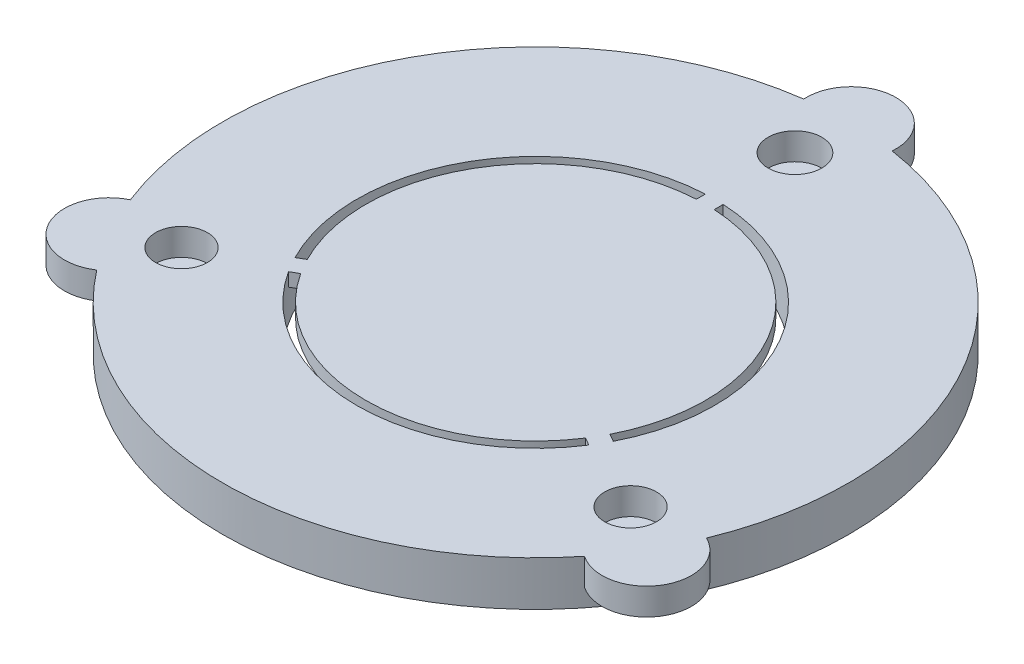
ISO-10303-21;
HEADER;
FILE_DESCRIPTION(('STEP AP214'),'2;1');
FILE_NAME('part.step','',(''),(''),'','','');
FILE_SCHEMA(('AUTOMOTIVE_DESIGN { 1 0 10303 214 1 1 1 1 }'));
ENDSEC;
DATA;
#1=APPLICATION_CONTEXT('core data for automotive mechanical design processes');
#2=APPLICATION_PROTOCOL_DEFINITION('international standard','automotive_design',2000,#1);
#3=PRODUCT_CONTEXT('',#1,'mechanical');
#4=PRODUCT('Part','Part','',(#3));
#5=PRODUCT_RELATED_PRODUCT_CATEGORY('part','',(#4));
#6=PRODUCT_DEFINITION_FORMATION('','',#4);
#7=PRODUCT_DEFINITION_CONTEXT('part definition',#1,'design');
#8=PRODUCT_DEFINITION('design','',#6,#7);
#9=PRODUCT_DEFINITION_SHAPE('','',#8);
#10=(LENGTH_UNIT() NAMED_UNIT(*) SI_UNIT(.MILLI.,.METRE.));
#11=(NAMED_UNIT(*) PLANE_ANGLE_UNIT() SI_UNIT($,.RADIAN.));
#12=(NAMED_UNIT(*) SI_UNIT($,.STERADIAN.) SOLID_ANGLE_UNIT());
#13=UNCERTAINTY_MEASURE_WITH_UNIT(LENGTH_MEASURE(1.E-05),#10,'distance_accuracy_value','');
#14=(GEOMETRIC_REPRESENTATION_CONTEXT(3) GLOBAL_UNCERTAINTY_ASSIGNED_CONTEXT((#13)) GLOBAL_UNIT_ASSIGNED_CONTEXT((#10,
#11,#12)) REPRESENTATION_CONTEXT('',''));
#15=CARTESIAN_POINT('',(0.,0.,0.));
#16=DIRECTION('',(0.,0.,1.));
#17=DIRECTION('',(1.,0.,0.));
#18=AXIS2_PLACEMENT_3D('',#15,#16,#17);
#19=CARTESIAN_POINT('',(0.,3.5,0.));
#20=DIRECTION('',(0.,1.,0.));
#21=DIRECTION('',(0.,0.,1.));
#22=AXIS2_PLACEMENT_3D('',#19,#20,#21);
#23=CYLINDRICAL_SURFACE('',#22,19.);
#24=DIRECTION('',(0.,1.,0.));
#25=VECTOR('',#24,1.);
#26=CARTESIAN_POINT('',(15.9316767251551,3.5,10.3528583842894));
#27=LINE('',#26,#25);
#28=CARTESIAN_POINT('',(15.9316767251551,5.,10.3528583842894));
#29=VERTEX_POINT('',#28);
#30=CARTESIAN_POINT('',(15.9316767251551,3.5,10.3528583842894));
#31=VERTEX_POINT('',#30);
#32=EDGE_CURVE('E11',#29,#31,#27,.F.);
#33=ORIENTED_EDGE('',*,*,#32,.F.);
#34=CARTESIAN_POINT('',(0.,5.,0.));
#35=DIRECTION('',(0.,1.,0.));
#36=DIRECTION('',(0.,0.,1.));
#37=AXIS2_PLACEMENT_3D('',#34,#35,#36);
#38=CIRCLE('',#37,19.);
#39=CARTESIAN_POINT('',(-15.9316767251549,5.,10.3528583842897));
#40=VERTEX_POINT('',#39);
#41=EDGE_CURVE('E222',#40,#29,#38,.T.);
#42=ORIENTED_EDGE('',*,*,#41,.F.);
#43=DIRECTION('',(0.,1.,0.));
#44=VECTOR('',#43,1.);
#45=CARTESIAN_POINT('',(-15.9316767251549,3.5,10.3528583842897));
#46=LINE('',#45,#44);
#47=CARTESIAN_POINT('',(-15.9316767251549,3.5,10.3528583842897));
#48=VERTEX_POINT('',#47);
#49=EDGE_CURVE('E329',#48,#40,#46,.T.);
#50=ORIENTED_EDGE('',*,*,#49,.F.);
#51=CARTESIAN_POINT('',(0.,3.5,0.));
#52=DIRECTION('',(0.,1.,0.));
#53=DIRECTION('',(0.,0.,1.));
#54=AXIS2_PLACEMENT_3D('',#51,#52,#53);
#55=CIRCLE('',#54,19.);
#56=EDGE_CURVE('E217',#48,#31,#55,.T.);
#57=ORIENTED_EDGE('',*,*,#56,.T.);
#58=EDGE_LOOP('',(#33,#42,#50,#57));
#59=FACE_BOUND('',#58,.T.);
#60=ADVANCED_FACE('F37',(#59),#23,.T.);
#61=DIRECTION('',(0.,1.,0.));
#62=VECTOR('',#61,1.);
#63=CARTESIAN_POINT('',(-16.9316767251549,3.5,8.62080757672078));
#64=LINE('',#63,#62);
#65=CARTESIAN_POINT('',(-16.9316767251549,5.,8.62080757672078));
#66=VERTEX_POINT('',#65);
#67=CARTESIAN_POINT('',(-16.9316767251549,3.5,8.62080757672078));
#68=VERTEX_POINT('',#67);
#69=EDGE_CURVE('E332',#66,#68,#64,.F.);
#70=ORIENTED_EDGE('',*,*,#69,.F.);
#71=CARTESIAN_POINT('',(-1.,5.,-18.9736659610103));
#72=VERTEX_POINT('',#71);
#73=EDGE_CURVE('E219',#72,#66,#38,.T.);
#74=ORIENTED_EDGE('',*,*,#73,.F.);
#75=DIRECTION('',(0.,1.,0.));
#76=VECTOR('',#75,1.);
#77=CARTESIAN_POINT('',(-1.,3.5,-18.9736659610103));
#78=LINE('',#77,#76);
#79=CARTESIAN_POINT('',(-1.,3.5,-18.9736659610103));
#80=VERTEX_POINT('',#79);
#81=EDGE_CURVE('E327',#72,#80,#78,.F.);
#82=ORIENTED_EDGE('',*,*,#81,.T.);
#83=EDGE_CURVE('E213',#80,#68,#55,.T.);
#84=ORIENTED_EDGE('',*,*,#83,.T.);
#85=EDGE_LOOP('',(#70,#74,#82,#84));
#86=FACE_BOUND('',#85,.T.);
#87=ADVANCED_FACE('F344',(#86),#23,.T.);
#88=CARTESIAN_POINT('',(0.,5.,0.));
#89=DIRECTION('',(0.,1.,0.));
#90=DIRECTION('',(0.,0.,1.));
#91=AXIS2_PLACEMENT_3D('',#88,#89,#90);
#92=PLANE('',#91);
#93=ORIENTED_EDGE('',*,*,#41,.T.);
#94=DIRECTION('',(0.866025403784443,0.,0.499999999999992));
#95=VECTOR('',#94,1.);
#96=CARTESIAN_POINT('',(19.8627653336479,5.,12.622473450611));
#97=LINE('',#96,#95);
#98=CARTESIAN_POINT('',(16.7988438920063,5.,10.8535175815034));
#99=VERTEX_POINT('',#98);
#100=EDGE_CURVE('E182',#29,#99,#97,.T.);
#101=ORIENTED_EDGE('',*,*,#100,.T.);
#102=CARTESIAN_POINT('',(0.,5.,0.));
#103=DIRECTION('',(0.,1.,0.));
#104=DIRECTION('',(0.,0.,1.));
#105=AXIS2_PLACEMENT_3D('',#102,#103,#104);
#106=CIRCLE('',#105,20.);
#107=CARTESIAN_POINT('',(-16.7988438920061,5.,10.8535175815036));
#108=VERTEX_POINT('',#107);
#109=EDGE_CURVE('E169',#108,#99,#106,.T.);
#110=ORIENTED_EDGE('',*,*,#109,.F.);
#111=DIRECTION('',(0.866025403784436,0.,-0.500000000000004));
#112=VECTOR('',#111,1.);
#113=CARTESIAN_POINT('',(-19.8627653336477,5.,12.6224734506113));
#114=LINE('',#113,#112);
#115=EDGE_CURVE('E193',#108,#40,#114,.T.);
#116=ORIENTED_EDGE('',*,*,#115,.T.);
#117=EDGE_LOOP('',(#93,#101,#110,#116));
#118=FACE_BOUND('',#117,.T.);
#119=CARTESIAN_POINT('',(17.7988438920063,5.,9.12146677393448));
#120=VERTEX_POINT('',#119);
#121=CARTESIAN_POINT('',(1.,5.,-19.9749843554382));
#122=VERTEX_POINT('',#121);
#123=EDGE_CURVE('E159',#120,#122,#106,.T.);
#124=ORIENTED_EDGE('',*,*,#123,.F.);
#125=DIRECTION('',(-0.866025403784443,0.,-0.499999999999992));
#126=VECTOR('',#125,1.);
#127=CARTESIAN_POINT('',(20.8627653336479,5.,10.8904226430421));
#128=LINE('',#127,#126);
#129=CARTESIAN_POINT('',(16.9316767251551,5.,8.62080757672054));
#130=VERTEX_POINT('',#129);
#131=EDGE_CURVE('E163',#120,#130,#128,.T.);
#132=ORIENTED_EDGE('',*,*,#131,.T.);
#133=CARTESIAN_POINT('',(1.,5.,-18.9736659610103));
#134=VERTEX_POINT('',#133);
#135=EDGE_CURVE('E212',#130,#134,#38,.T.);
#136=ORIENTED_EDGE('',*,*,#135,.T.);
#137=DIRECTION('',(0.,0.,-1.));
#138=VECTOR('',#137,1.);
#139=CARTESIAN_POINT('',(1.,5.,-23.5128960936534));
#140=LINE('',#139,#138);
#141=EDGE_CURVE('E166',#134,#122,#140,.T.);
#142=ORIENTED_EDGE('',*,*,#141,.T.);
#143=EDGE_LOOP('',(#124,#132,#136,#142));
#144=FACE_BOUND('',#143,.T.);
#145=ORIENTED_EDGE('',*,*,#73,.T.);
#146=DIRECTION('',(-0.866025403784436,0.,0.500000000000004));
#147=VECTOR('',#146,1.);
#148=CARTESIAN_POINT('',(-20.8627653336477,5.,10.8904226430424));
#149=LINE('',#148,#147);
#150=CARTESIAN_POINT('',(-17.7988438920062,5.,9.12146677393473));
#151=VERTEX_POINT('',#150);
#152=EDGE_CURVE('E197',#66,#151,#149,.T.);
#153=ORIENTED_EDGE('',*,*,#152,.T.);
#154=CARTESIAN_POINT('',(-1.,5.,-19.9749843554382));
#155=VERTEX_POINT('',#154);
#156=EDGE_CURVE('E172',#155,#151,#106,.T.);
#157=ORIENTED_EDGE('',*,*,#156,.F.);
#158=DIRECTION('',(0.,0.,1.));
#159=VECTOR('',#158,1.);
#160=CARTESIAN_POINT('',(-1.,5.,-23.5128960936534));
#161=LINE('',#160,#159);
#162=EDGE_CURVE('E225',#155,#72,#161,.T.);
#163=ORIENTED_EDGE('',*,*,#162,.T.);
#164=EDGE_LOOP('',(#145,#153,#157,#163));
#165=FACE_BOUND('',#164,.T.);
#166=CARTESIAN_POINT('',(0.,5.,-29.));
#167=DIRECTION('',(0.,1.,0.));
#168=DIRECTION('',(0.,0.,1.));
#169=AXIS2_PLACEMENT_3D('',#166,#167,#168);
#170=CIRCLE('',#169,3.);
#171=CARTESIAN_POINT('',(0.,5.,-26.));
#172=VERTEX_POINT('',#171);
#173=EDGE_CURVE('E239',#172,#172,#170,.T.);
#174=ORIENTED_EDGE('',*,*,#173,.F.);
#175=EDGE_LOOP('',(#174));
#176=FACE_BOUND('',#175,.T.);
#177=CARTESIAN_POINT('',(25.1147367097487,5.,14.5));
#178=DIRECTION('',(0.,1.,0.));
#179=DIRECTION('',(0.,0.,1.));
#180=AXIS2_PLACEMENT_3D('',#177,#178,#179);
#181=CIRCLE('',#180,2.9);
#182=CARTESIAN_POINT('',(25.1147367097487,5.,17.4));
#183=VERTEX_POINT('',#182);
#184=EDGE_CURVE('E245',#183,#183,#181,.T.);
#185=ORIENTED_EDGE('',*,*,#184,.F.);
#186=EDGE_LOOP('',(#185));
#187=FACE_BOUND('',#186,.T.);
#188=CARTESIAN_POINT('',(-25.1147367097487,5.,14.5));
#189=DIRECTION('',(0.,1.,0.));
#190=DIRECTION('',(0.,0.,1.));
#191=AXIS2_PLACEMENT_3D('',#188,#189,#190);
#192=CIRCLE('',#191,2.9);
#193=CARTESIAN_POINT('',(-25.1147367097487,5.,17.4));
#194=VERTEX_POINT('',#193);
#195=EDGE_CURVE('E231',#194,#194,#192,.T.);
#196=ORIENTED_EDGE('',*,*,#195,.F.);
#197=EDGE_LOOP('',(#196));
#198=FACE_BOUND('',#197,.T.);
#199=CARTESIAN_POINT('',(0.,5.,0.));
#200=DIRECTION('',(0.,1.,0.));
#201=DIRECTION('',(0.,0.,1.));
#202=AXIS2_PLACEMENT_3D('',#199,#200,#201);
#203=CIRCLE('',#202,35.);
#204=CARTESIAN_POINT('',(-27.684829307094,5.,21.413785892202));
#205=VERTEX_POINT('',#204);
#206=CARTESIAN_POINT('',(27.3292743385288,5.,21.8657440790254));
#207=VERTEX_POINT('',#206);
#208=EDGE_CURVE('E280',#205,#207,#203,.T.);
#209=ORIENTED_EDGE('',*,*,#208,.T.);
#210=CARTESIAN_POINT('',(30.1661031621676,5.,17.7484145773493));
#211=DIRECTION('',(0.,1.,0.));
#212=DIRECTION('',(0.,0.,1.));
#213=AXIS2_PLACEMENT_3D('',#210,#211,#212);
#214=CIRCLE('',#213,5.);
#215=CARTESIAN_POINT('',(32.3872972273948,5.,13.2688725332783));
#216=VERTEX_POINT('',#215);
#217=EDGE_CURVE('E257',#207,#216,#214,.T.);
#218=ORIENTED_EDGE('',*,*,#217,.T.);
#219=CARTESIAN_POINT('',(5.27165267582073,5.,-34.6007178836728));
#220=VERTEX_POINT('',#219);
#221=EDGE_CURVE('E284',#216,#220,#203,.T.);
#222=ORIENTED_EDGE('',*,*,#221,.T.);
#223=CARTESIAN_POINT('',(0.287526319798734,5.,-34.9988189602938));
#224=DIRECTION('',(0.,1.,0.));
#225=DIRECTION('',(0.,0.,1.));
#226=AXIS2_PLACEMENT_3D('',#223,#224,#225);
#227=CIRCLE('',#226,5.);
#228=CARTESIAN_POINT('',(-4.70246792030079,5.,-34.6826584254803));
#229=VERTEX_POINT('',#228);
#230=EDGE_CURVE('E256',#220,#229,#227,.T.);
#231=ORIENTED_EDGE('',*,*,#230,.T.);
#232=CARTESIAN_POINT('',(-32.6009270143495,5.,12.7349738046474));
#233=VERTEX_POINT('',#232);
#234=EDGE_CURVE('E285',#229,#233,#203,.T.);
#235=ORIENTED_EDGE('',*,*,#234,.T.);
#236=CARTESIAN_POINT('',(-30.4536294819663,5.,17.2504043829445));
#237=DIRECTION('',(0.,1.,0.));
#238=DIRECTION('',(0.,0.,1.));
#239=AXIS2_PLACEMENT_3D('',#236,#237,#238);
#240=CIRCLE('',#239,5.);
#241=EDGE_CURVE('E262',#233,#205,#240,.T.);
#242=ORIENTED_EDGE('',*,*,#241,.T.);
#243=EDGE_LOOP('',(#209,#218,#222,#231,#235,#242));
#244=FACE_BOUND('',#243,.T.);
#245=ADVANCED_FACE('F160',(#118,#144,#165,#176,#187,#198,#244),#92,.T.);
#246=CARTESIAN_POINT('',(0.,5.,0.));
#247=DIRECTION('',(0.,-1.,0.));
#248=DIRECTION('',(0.,0.,-1.));
#249=AXIS2_PLACEMENT_3D('',#246,#247,#248);
#250=CYLINDRICAL_SURFACE('',#249,35.);
#251=CARTESIAN_POINT('',(0.,2.,0.));
#252=DIRECTION('',(0.,1.,0.));
#253=DIRECTION('',(0.,0.,1.));
#254=AXIS2_PLACEMENT_3D('',#251,#252,#253);
#255=CIRCLE('',#254,35.);
#256=CARTESIAN_POINT('',(27.3292743385288,2.,21.8657440790254));
#257=VERTEX_POINT('',#256);
#258=CARTESIAN_POINT('',(32.3872972273948,2.,13.2688725332783));
#259=VERTEX_POINT('',#258);
#260=EDGE_CURVE('E309',#257,#259,#255,.T.);
#261=ORIENTED_EDGE('',*,*,#260,.F.);
#262=DIRECTION('',(0.,1.,0.));
#263=VECTOR('',#262,1.);
#264=CARTESIAN_POINT('',(27.3292743385288,3.5,21.8657440790254));
#265=LINE('',#264,#263);
#266=EDGE_CURVE('E314',#257,#207,#265,.T.);
#267=ORIENTED_EDGE('',*,*,#266,.T.);
#268=ORIENTED_EDGE('',*,*,#208,.F.);
#269=DIRECTION('',(0.,1.,0.));
#270=VECTOR('',#269,1.);
#271=CARTESIAN_POINT('',(-27.684829307094,3.5,21.413785892202));
#272=LINE('',#271,#270);
#273=CARTESIAN_POINT('',(-27.684829307094,2.,21.413785892202));
#274=VERTEX_POINT('',#273);
#275=EDGE_CURVE('E295',#205,#274,#272,.F.);
#276=ORIENTED_EDGE('',*,*,#275,.T.);
#277=CARTESIAN_POINT('',(0.,2.,0.));
#278=DIRECTION('',(0.,1.,0.));
#279=DIRECTION('',(0.,0.,1.));
#280=AXIS2_PLACEMENT_3D('',#277,#278,#279);
#281=CIRCLE('',#280,35.);
#282=CARTESIAN_POINT('',(-32.6009270143495,2.,12.7349738046474));
#283=VERTEX_POINT('',#282);
#284=EDGE_CURVE('E283',#283,#274,#281,.T.);
#285=ORIENTED_EDGE('',*,*,#284,.F.);
#286=DIRECTION('',(0.,1.,0.));
#287=VECTOR('',#286,1.);
#288=CARTESIAN_POINT('',(-32.6009270143495,3.5,12.7349738046474));
#289=LINE('',#288,#287);
#290=EDGE_CURVE('E298',#283,#233,#289,.T.);
#291=ORIENTED_EDGE('',*,*,#290,.T.);
#292=ORIENTED_EDGE('',*,*,#234,.F.);
#293=DIRECTION('',(0.,1.,0.));
#294=VECTOR('',#293,1.);
#295=CARTESIAN_POINT('',(-4.70246792030079,3.5,-34.6826584254803));
#296=LINE('',#295,#294);
#297=CARTESIAN_POINT('',(-4.70246792030079,2.,-34.6826584254803));
#298=VERTEX_POINT('',#297);
#299=EDGE_CURVE('E303',#229,#298,#296,.F.);
#300=ORIENTED_EDGE('',*,*,#299,.T.);
#301=CARTESIAN_POINT('',(0.,2.,0.));
#302=DIRECTION('',(0.,1.,0.));
#303=DIRECTION('',(0.,0.,1.));
#304=AXIS2_PLACEMENT_3D('',#301,#302,#303);
#305=CIRCLE('',#304,35.);
#306=CARTESIAN_POINT('',(5.27165267582073,2.,-34.6007178836728));
#307=VERTEX_POINT('',#306);
#308=EDGE_CURVE('E301',#307,#298,#305,.T.);
#309=ORIENTED_EDGE('',*,*,#308,.F.);
#310=DIRECTION('',(0.,1.,0.));
#311=VECTOR('',#310,1.);
#312=CARTESIAN_POINT('',(5.27165267582073,3.5,-34.6007178836728));
#313=LINE('',#312,#311);
#314=EDGE_CURVE('E306',#307,#220,#313,.T.);
#315=ORIENTED_EDGE('',*,*,#314,.T.);
#316=ORIENTED_EDGE('',*,*,#221,.F.);
#317=DIRECTION('',(0.,1.,0.));
#318=VECTOR('',#317,1.);
#319=CARTESIAN_POINT('',(32.3872972273948,3.5,13.2688725332783));
#320=LINE('',#319,#318);
#321=EDGE_CURVE('E311',#216,#259,#320,.F.);
#322=ORIENTED_EDGE('',*,*,#321,.T.);
#323=EDGE_LOOP('',(#261,#267,#268,#276,#285,#291,#292,#300,#309,#315,#316,#322));
#324=FACE_BOUND('',#323,.T.);
#325=CARTESIAN_POINT('',(0.,0.,0.));
#326=DIRECTION('',(0.,1.,0.));
#327=DIRECTION('',(0.,0.,1.));
#328=AXIS2_PLACEMENT_3D('',#325,#326,#327);
#329=CIRCLE('',#328,35.);
#330=CARTESIAN_POINT('',(0.,0.,35.));
#331=VERTEX_POINT('',#330);
#332=EDGE_CURVE('E279',#331,#331,#329,.T.);
#333=ORIENTED_EDGE('',*,*,#332,.T.);
#334=EDGE_LOOP('',(#333));
#335=FACE_BOUND('',#334,.T.);
#336=ADVANCED_FACE('F471',(#324,#335),#250,.T.);
#337=CARTESIAN_POINT('',(0.,5.,0.));
#338=DIRECTION('',(0.,-1.,0.));
#339=DIRECTION('',(0.,0.,-1.));
#340=AXIS2_PLACEMENT_3D('',#337,#338,#339);
#341=CYLINDRICAL_SURFACE('',#340,20.);
#342=DIRECTION('',(0.,-1.,0.));
#343=VECTOR('',#342,1.);
#344=CARTESIAN_POINT('',(16.7988438920063,5.,10.8535175815034));
#345=LINE('',#344,#343);
#346=CARTESIAN_POINT('',(16.7988438920063,3.5,10.8535175815034));
#347=VERTEX_POINT('',#346);
#348=EDGE_CURVE('E52',#347,#99,#345,.F.);
#349=ORIENTED_EDGE('',*,*,#348,.F.);
#350=CARTESIAN_POINT('',(0.,3.5,0.));
#351=DIRECTION('',(0.,-1.,0.));
#352=DIRECTION('',(0.,0.,-1.));
#353=AXIS2_PLACEMENT_3D('',#350,#351,#352);
#354=CIRCLE('',#353,20.);
#355=CARTESIAN_POINT('',(17.7988438920063,3.5,9.12146677393448));
#356=VERTEX_POINT('',#355);
#357=EDGE_CURVE('E56',#356,#347,#354,.T.);
#358=ORIENTED_EDGE('',*,*,#357,.F.);
#359=DIRECTION('',(0.,-1.,0.));
#360=VECTOR('',#359,1.);
#361=CARTESIAN_POINT('',(17.7988438920063,5.,9.12146677393448));
#362=LINE('',#361,#360);
#363=EDGE_CURVE('E173',#120,#356,#362,.T.);
#364=ORIENTED_EDGE('',*,*,#363,.F.);
#365=ORIENTED_EDGE('',*,*,#123,.T.);
#366=DIRECTION('',(0.,-1.,0.));
#367=VECTOR('',#366,1.);
#368=CARTESIAN_POINT('',(1.,5.,-19.9749843554382));
#369=LINE('',#368,#367);
#370=CARTESIAN_POINT('',(1.,3.5,-19.9749843554382));
#371=VERTEX_POINT('',#370);
#372=EDGE_CURVE('E325',#371,#122,#369,.F.);
#373=ORIENTED_EDGE('',*,*,#372,.F.);
#374=CARTESIAN_POINT('',(0.,3.5,0.));
#375=DIRECTION('',(0.,-1.,0.));
#376=DIRECTION('',(0.,0.,-1.));
#377=AXIS2_PLACEMENT_3D('',#374,#375,#376);
#378=CIRCLE('',#377,20.);
#379=CARTESIAN_POINT('',(-1.,3.5,-19.9749843554382));
#380=VERTEX_POINT('',#379);
#381=EDGE_CURVE('E317',#380,#371,#378,.T.);
#382=ORIENTED_EDGE('',*,*,#381,.F.);
#383=DIRECTION('',(0.,-1.,0.));
#384=VECTOR('',#383,1.);
#385=CARTESIAN_POINT('',(-1.,5.,-19.9749843554382));
#386=LINE('',#385,#384);
#387=EDGE_CURVE('E322',#155,#380,#386,.T.);
#388=ORIENTED_EDGE('',*,*,#387,.F.);
#389=ORIENTED_EDGE('',*,*,#156,.T.);
#390=DIRECTION('',(0.,-1.,0.));
#391=VECTOR('',#390,1.);
#392=CARTESIAN_POINT('',(-17.7988438920062,5.,9.12146677393473));
#393=LINE('',#392,#391);
#394=CARTESIAN_POINT('',(-17.7988438920062,3.5,9.12146677393473));
#395=VERTEX_POINT('',#394);
#396=EDGE_CURVE('E209',#395,#151,#393,.F.);
#397=ORIENTED_EDGE('',*,*,#396,.F.);
#398=CARTESIAN_POINT('',(0.,3.5,0.));
#399=DIRECTION('',(0.,-1.,0.));
#400=DIRECTION('',(0.,0.,-1.));
#401=AXIS2_PLACEMENT_3D('',#398,#399,#400);
#402=CIRCLE('',#401,20.);
#403=CARTESIAN_POINT('',(-16.7988438920061,3.5,10.8535175815036));
#404=VERTEX_POINT('',#403);
#405=EDGE_CURVE('E200',#404,#395,#402,.T.);
#406=ORIENTED_EDGE('',*,*,#405,.F.);
#407=DIRECTION('',(0.,-1.,0.));
#408=VECTOR('',#407,1.);
#409=CARTESIAN_POINT('',(-16.7988438920061,5.,10.8535175815036));
#410=LINE('',#409,#408);
#411=EDGE_CURVE('E206',#108,#404,#410,.T.);
#412=ORIENTED_EDGE('',*,*,#411,.F.);
#413=ORIENTED_EDGE('',*,*,#109,.T.);
#414=EDGE_LOOP('',(#349,#358,#364,#365,#373,#382,#388,#389,#397,#406,#412,#413));
#415=FACE_BOUND('',#414,.T.);
#416=CARTESIAN_POINT('',(0.,0.,0.));
#417=DIRECTION('',(0.,1.,0.));
#418=DIRECTION('',(0.,0.,1.));
#419=AXIS2_PLACEMENT_3D('',#416,#417,#418);
#420=CIRCLE('',#419,20.);
#421=CARTESIAN_POINT('',(0.,0.,20.));
#422=VERTEX_POINT('',#421);
#423=EDGE_CURVE('E238',#422,#422,#420,.T.);
#424=ORIENTED_EDGE('',*,*,#423,.F.);
#425=EDGE_LOOP('',(#424));
#426=FACE_BOUND('',#425,.T.);
#427=ADVANCED_FACE('F174',(#415,#426),#341,.F.);
#428=CARTESIAN_POINT('',(0.,0.,0.));
#429=DIRECTION('',(0.,1.,0.));
#430=DIRECTION('',(0.,0.,1.));
#431=AXIS2_PLACEMENT_3D('',#428,#429,#430);
#432=PLANE('',#431);
#433=ORIENTED_EDGE('',*,*,#423,.T.);
#434=EDGE_LOOP('',(#433));
#435=FACE_BOUND('',#434,.T.);
#436=CARTESIAN_POINT('',(0.,0.,-29.));
#437=DIRECTION('',(0.,1.,0.));
#438=DIRECTION('',(0.,0.,1.));
#439=AXIS2_PLACEMENT_3D('',#436,#437,#438);
#440=CIRCLE('',#439,2.9);
#441=CARTESIAN_POINT('',(0.,0.,-26.1));
#442=VERTEX_POINT('',#441);
#443=EDGE_CURVE('E271',#442,#442,#440,.T.);
#444=ORIENTED_EDGE('',*,*,#443,.T.);
#445=EDGE_LOOP('',(#444));
#446=FACE_BOUND('',#445,.T.);
#447=CARTESIAN_POINT('',(25.1147367097487,0.,14.5));
#448=DIRECTION('',(0.,1.,0.));
#449=DIRECTION('',(0.,0.,1.));
#450=AXIS2_PLACEMENT_3D('',#447,#448,#449);
#451=CIRCLE('',#450,2.9);
#452=CARTESIAN_POINT('',(25.1147367097487,0.,17.4));
#453=VERTEX_POINT('',#452);
#454=EDGE_CURVE('E275',#453,#453,#451,.T.);
#455=ORIENTED_EDGE('',*,*,#454,.T.);
#456=EDGE_LOOP('',(#455));
#457=FACE_BOUND('',#456,.T.);
#458=CARTESIAN_POINT('',(-25.1147367097487,0.,14.5));
#459=DIRECTION('',(0.,1.,0.));
#460=DIRECTION('',(0.,0.,1.));
#461=AXIS2_PLACEMENT_3D('',#458,#459,#460);
#462=CIRCLE('',#461,2.9);
#463=CARTESIAN_POINT('',(-25.1147367097487,0.,17.4));
#464=VERTEX_POINT('',#463);
#465=EDGE_CURVE('E170',#464,#464,#462,.T.);
#466=ORIENTED_EDGE('',*,*,#465,.T.);
#467=EDGE_LOOP('',(#466));
#468=FACE_BOUND('',#467,.T.);
#469=ORIENTED_EDGE('',*,*,#332,.F.);
#470=EDGE_LOOP('',(#469));
#471=FACE_BOUND('',#470,.T.);
#472=ADVANCED_FACE('F39',(#435,#446,#457,#468,#471),#432,.F.);
#473=CARTESIAN_POINT('',(-25.1147367097487,-2.,14.5));
#474=DIRECTION('',(0.,-1.,0.));
#475=DIRECTION('',(0.,0.,-1.));
#476=AXIS2_PLACEMENT_3D('',#473,#474,#475);
#477=PLANE('',#476);
#478=CARTESIAN_POINT('',(-25.1147367097487,-2.,14.5));
#479=DIRECTION('',(0.,-1.,0.));
#480=DIRECTION('',(0.,0.,-1.));
#481=AXIS2_PLACEMENT_3D('',#478,#479,#480);
#482=CIRCLE('',#481,2.9);
#483=CARTESIAN_POINT('',(-25.1147367097487,-2.,11.6));
#484=VERTEX_POINT('',#483);
#485=EDGE_CURVE('E276',#484,#484,#482,.T.);
#486=ORIENTED_EDGE('',*,*,#485,.T.);
#487=EDGE_LOOP('',(#486));
#488=FACE_BOUND('',#487,.T.);
#489=ADVANCED_FACE('F462',(#488),#477,.T.);
#490=CARTESIAN_POINT('',(-25.1147367097487,13.2024386617639,14.5));
#491=DIRECTION('',(0.,-1.,0.));
#492=DIRECTION('',(0.,0.,-1.));
#493=AXIS2_PLACEMENT_3D('',#490,#491,#492);
#494=CYLINDRICAL_SURFACE('',#493,2.9);
#495=ORIENTED_EDGE('',*,*,#485,.F.);
#496=EDGE_LOOP('',(#495));
#497=FACE_BOUND('',#496,.T.);
#498=ORIENTED_EDGE('',*,*,#465,.F.);
#499=EDGE_LOOP('',(#498));
#500=FACE_BOUND('',#499,.T.);
#501=ADVANCED_FACE('F457',(#497,#500),#494,.T.);
#502=CARTESIAN_POINT('',(25.1147367097487,-2.,14.5));
#503=DIRECTION('',(0.,-1.,0.));
#504=DIRECTION('',(0.,0.,-1.));
#505=AXIS2_PLACEMENT_3D('',#502,#503,#504);
#506=PLANE('',#505);
#507=CARTESIAN_POINT('',(25.1147367097487,-2.,14.5));
#508=DIRECTION('',(0.,-1.,0.));
#509=DIRECTION('',(0.,0.,-1.));
#510=AXIS2_PLACEMENT_3D('',#507,#508,#509);
#511=CIRCLE('',#510,2.9);
#512=CARTESIAN_POINT('',(25.1147367097487,-2.,11.6));
#513=VERTEX_POINT('',#512);
#514=EDGE_CURVE('E272',#513,#513,#511,.T.);
#515=ORIENTED_EDGE('',*,*,#514,.T.);
#516=EDGE_LOOP('',(#515));
#517=FACE_BOUND('',#516,.T.);
#518=ADVANCED_FACE('F454',(#517),#506,.T.);
#519=CARTESIAN_POINT('',(25.1147367097487,13.2024386617639,14.5));
#520=DIRECTION('',(0.,-1.,0.));
#521=DIRECTION('',(0.,0.,-1.));
#522=AXIS2_PLACEMENT_3D('',#519,#520,#521);
#523=CYLINDRICAL_SURFACE('',#522,2.9);
#524=ORIENTED_EDGE('',*,*,#514,.F.);
#525=EDGE_LOOP('',(#524));
#526=FACE_BOUND('',#525,.T.);
#527=ORIENTED_EDGE('',*,*,#454,.F.);
#528=EDGE_LOOP('',(#527));
#529=FACE_BOUND('',#528,.T.);
#530=ADVANCED_FACE('F449',(#526,#529),#523,.T.);
#531=CARTESIAN_POINT('',(0.,-2.,-29.));
#532=DIRECTION('',(0.,-1.,0.));
#533=DIRECTION('',(0.,0.,-1.));
#534=AXIS2_PLACEMENT_3D('',#531,#532,#533);
#535=PLANE('',#534);
#536=CARTESIAN_POINT('',(0.,-2.,-29.));
#537=DIRECTION('',(0.,-1.,0.));
#538=DIRECTION('',(0.,0.,-1.));
#539=AXIS2_PLACEMENT_3D('',#536,#537,#538);
#540=CIRCLE('',#539,2.9);
#541=CARTESIAN_POINT('',(0.,-2.,-31.9));
#542=VERTEX_POINT('',#541);
#543=EDGE_CURVE('E267',#542,#542,#540,.T.);
#544=ORIENTED_EDGE('',*,*,#543,.T.);
#545=EDGE_LOOP('',(#544));
#546=FACE_BOUND('',#545,.T.);
#547=ADVANCED_FACE('F446',(#546),#535,.T.);
#548=CARTESIAN_POINT('',(0.,13.2024386617639,-29.));
#549=DIRECTION('',(0.,-1.,0.));
#550=DIRECTION('',(0.,0.,-1.));
#551=AXIS2_PLACEMENT_3D('',#548,#549,#550);
#552=CYLINDRICAL_SURFACE('',#551,2.9);
#553=ORIENTED_EDGE('',*,*,#543,.F.);
#554=EDGE_LOOP('',(#553));
#555=FACE_BOUND('',#554,.T.);
#556=ORIENTED_EDGE('',*,*,#443,.F.);
#557=EDGE_LOOP('',(#556));
#558=FACE_BOUND('',#557,.T.);
#559=ADVANCED_FACE('F444',(#555,#558),#552,.T.);
#560=CARTESIAN_POINT('',(-30.4536294819663,2.,17.2504043829445));
#561=DIRECTION('',(0.,1.,0.));
#562=DIRECTION('',(0.,0.,1.));
#563=AXIS2_PLACEMENT_3D('',#560,#561,#562);
#564=CYLINDRICAL_SURFACE('',#563,5.);
#565=ORIENTED_EDGE('',*,*,#290,.F.);
#566=CARTESIAN_POINT('',(-30.4536294819663,2.,17.2504043829445));
#567=DIRECTION('',(0.,1.,0.));
#568=DIRECTION('',(0.,0.,1.));
#569=AXIS2_PLACEMENT_3D('',#566,#567,#568);
#570=CIRCLE('',#569,5.);
#571=EDGE_CURVE('E264',#283,#274,#570,.T.);
#572=ORIENTED_EDGE('',*,*,#571,.T.);
#573=ORIENTED_EDGE('',*,*,#275,.F.);
#574=ORIENTED_EDGE('',*,*,#241,.F.);
#575=EDGE_LOOP('',(#565,#572,#573,#574));
#576=FACE_BOUND('',#575,.T.);
#577=ADVANCED_FACE('F440',(#576),#564,.T.);
#578=CARTESIAN_POINT('',(-30.4536294819663,2.,17.2504043829445));
#579=DIRECTION('',(0.,1.,0.));
#580=DIRECTION('',(0.,0.,1.));
#581=AXIS2_PLACEMENT_3D('',#578,#579,#580);
#582=PLANE('',#581);
#583=ORIENTED_EDGE('',*,*,#571,.F.);
#584=ORIENTED_EDGE('',*,*,#284,.T.);
#585=EDGE_LOOP('',(#583,#584));
#586=FACE_BOUND('',#585,.T.);
#587=ADVANCED_FACE('F436',(#586),#582,.F.);
#588=CARTESIAN_POINT('',(0.287526319798734,2.,-34.9988189602938));
#589=DIRECTION('',(0.,1.,0.));
#590=DIRECTION('',(0.,0.,1.));
#591=AXIS2_PLACEMENT_3D('',#588,#589,#590);
#592=CYLINDRICAL_SURFACE('',#591,5.);
#593=ORIENTED_EDGE('',*,*,#314,.F.);
#594=CARTESIAN_POINT('',(0.287526319798734,2.,-34.9988189602938));
#595=DIRECTION('',(0.,1.,0.));
#596=DIRECTION('',(0.,0.,1.));
#597=AXIS2_PLACEMENT_3D('',#594,#595,#596);
#598=CIRCLE('',#597,5.);
#599=EDGE_CURVE('E259',#307,#298,#598,.T.);
#600=ORIENTED_EDGE('',*,*,#599,.T.);
#601=ORIENTED_EDGE('',*,*,#299,.F.);
#602=ORIENTED_EDGE('',*,*,#230,.F.);
#603=EDGE_LOOP('',(#593,#600,#601,#602));
#604=FACE_BOUND('',#603,.T.);
#605=ADVANCED_FACE('F432',(#604),#592,.T.);
#606=CARTESIAN_POINT('',(0.287526319798734,2.,-34.9988189602938));
#607=DIRECTION('',(0.,1.,0.));
#608=DIRECTION('',(0.,0.,1.));
#609=AXIS2_PLACEMENT_3D('',#606,#607,#608);
#610=PLANE('',#609);
#611=ORIENTED_EDGE('',*,*,#599,.F.);
#612=ORIENTED_EDGE('',*,*,#308,.T.);
#613=EDGE_LOOP('',(#611,#612));
#614=FACE_BOUND('',#613,.T.);
#615=ADVANCED_FACE('F428',(#614),#610,.F.);
#616=CARTESIAN_POINT('',(30.1661031621676,2.,17.7484145773493));
#617=DIRECTION('',(0.,1.,0.));
#618=DIRECTION('',(0.,0.,1.));
#619=AXIS2_PLACEMENT_3D('',#616,#617,#618);
#620=CYLINDRICAL_SURFACE('',#619,5.);
#621=ORIENTED_EDGE('',*,*,#266,.F.);
#622=CARTESIAN_POINT('',(30.1661031621676,2.,17.7484145773493));
#623=DIRECTION('',(0.,1.,0.));
#624=DIRECTION('',(0.,0.,1.));
#625=AXIS2_PLACEMENT_3D('',#622,#623,#624);
#626=CIRCLE('',#625,5.);
#627=EDGE_CURVE('E253',#257,#259,#626,.T.);
#628=ORIENTED_EDGE('',*,*,#627,.T.);
#629=ORIENTED_EDGE('',*,*,#321,.F.);
#630=ORIENTED_EDGE('',*,*,#217,.F.);
#631=EDGE_LOOP('',(#621,#628,#629,#630));
#632=FACE_BOUND('',#631,.T.);
#633=ADVANCED_FACE('F424',(#632),#620,.T.);
#634=CARTESIAN_POINT('',(30.1661031621676,2.,17.7484145773493));
#635=DIRECTION('',(0.,1.,0.));
#636=DIRECTION('',(0.,0.,1.));
#637=AXIS2_PLACEMENT_3D('',#634,#635,#636);
#638=PLANE('',#637);
#639=ORIENTED_EDGE('',*,*,#627,.F.);
#640=ORIENTED_EDGE('',*,*,#260,.T.);
#641=EDGE_LOOP('',(#639,#640));
#642=FACE_BOUND('',#641,.T.);
#643=ADVANCED_FACE('F420',(#642),#638,.F.);
#644=CARTESIAN_POINT('',(-25.1147367097487,2.,14.5));
#645=DIRECTION('',(0.,1.,0.));
#646=DIRECTION('',(0.,0.,1.));
#647=AXIS2_PLACEMENT_3D('',#644,#645,#646);
#648=CYLINDRICAL_SURFACE('',#647,2.9);
#649=CARTESIAN_POINT('',(-25.1147367097487,2.,14.5));
#650=DIRECTION('',(0.,1.,0.));
#651=DIRECTION('',(0.,0.,1.));
#652=AXIS2_PLACEMENT_3D('',#649,#650,#651);
#653=CIRCLE('',#652,2.9);
#654=CARTESIAN_POINT('',(-25.1147367097487,2.,17.4));
#655=VERTEX_POINT('',#654);
#656=EDGE_CURVE('E248',#655,#655,#653,.T.);
#657=ORIENTED_EDGE('',*,*,#656,.F.);
#658=EDGE_LOOP('',(#657));
#659=FACE_BOUND('',#658,.T.);
#660=ORIENTED_EDGE('',*,*,#195,.T.);
#661=EDGE_LOOP('',(#660));
#662=FACE_BOUND('',#661,.T.);
#663=ADVANCED_FACE('F416',(#659,#662),#648,.F.);
#664=CARTESIAN_POINT('',(-25.1147367097487,2.,14.5));
#665=DIRECTION('',(0.,1.,0.));
#666=DIRECTION('',(0.,0.,1.));
#667=AXIS2_PLACEMENT_3D('',#664,#665,#666);
#668=PLANE('',#667);
#669=ORIENTED_EDGE('',*,*,#656,.T.);
#670=EDGE_LOOP('',(#669));
#671=FACE_BOUND('',#670,.T.);
#672=ADVANCED_FACE('F412',(#671),#668,.T.);
#673=CARTESIAN_POINT('',(25.1147367097487,2.,14.5));
#674=DIRECTION('',(0.,1.,0.));
#675=DIRECTION('',(0.,0.,1.));
#676=AXIS2_PLACEMENT_3D('',#673,#674,#675);
#677=CYLINDRICAL_SURFACE('',#676,2.9);
#678=CARTESIAN_POINT('',(25.1147367097487,2.,14.5));
#679=DIRECTION('',(0.,1.,0.));
#680=DIRECTION('',(0.,0.,1.));
#681=AXIS2_PLACEMENT_3D('',#678,#679,#680);
#682=CIRCLE('',#681,2.9);
#683=CARTESIAN_POINT('',(25.1147367097487,2.,17.4));
#684=VERTEX_POINT('',#683);
#685=EDGE_CURVE('E242',#684,#684,#682,.T.);
#686=ORIENTED_EDGE('',*,*,#685,.F.);
#687=EDGE_LOOP('',(#686));
#688=FACE_BOUND('',#687,.T.);
#689=ORIENTED_EDGE('',*,*,#184,.T.);
#690=EDGE_LOOP('',(#689));
#691=FACE_BOUND('',#690,.T.);
#692=ADVANCED_FACE('F408',(#688,#691),#677,.F.);
#693=CARTESIAN_POINT('',(25.1147367097487,2.,14.5));
#694=DIRECTION('',(0.,1.,0.));
#695=DIRECTION('',(0.,0.,1.));
#696=AXIS2_PLACEMENT_3D('',#693,#694,#695);
#697=PLANE('',#696);
#698=ORIENTED_EDGE('',*,*,#685,.T.);
#699=EDGE_LOOP('',(#698));
#700=FACE_BOUND('',#699,.T.);
#701=ADVANCED_FACE('F404',(#700),#697,.T.);
#702=CARTESIAN_POINT('',(0.,2.,-29.));
#703=DIRECTION('',(0.,1.,0.));
#704=DIRECTION('',(0.,0.,1.));
#705=AXIS2_PLACEMENT_3D('',#702,#703,#704);
#706=CYLINDRICAL_SURFACE('',#705,3.);
#707=CARTESIAN_POINT('',(0.,2.,-29.));
#708=DIRECTION('',(0.,1.,0.));
#709=DIRECTION('',(0.,0.,1.));
#710=AXIS2_PLACEMENT_3D('',#707,#708,#709);
#711=CIRCLE('',#710,3.);
#712=CARTESIAN_POINT('',(0.,2.,-26.));
#713=VERTEX_POINT('',#712);
#714=EDGE_CURVE('E235',#713,#713,#711,.T.);
#715=ORIENTED_EDGE('',*,*,#714,.F.);
#716=EDGE_LOOP('',(#715));
#717=FACE_BOUND('',#716,.T.);
#718=ORIENTED_EDGE('',*,*,#173,.T.);
#719=EDGE_LOOP('',(#718));
#720=FACE_BOUND('',#719,.T.);
#721=ADVANCED_FACE('F400',(#717,#720),#706,.F.);
#722=CARTESIAN_POINT('',(0.,2.,-29.));
#723=DIRECTION('',(0.,1.,0.));
#724=DIRECTION('',(0.,0.,1.));
#725=AXIS2_PLACEMENT_3D('',#722,#723,#724);
#726=PLANE('',#725);
#727=ORIENTED_EDGE('',*,*,#714,.T.);
#728=EDGE_LOOP('',(#727));
#729=FACE_BOUND('',#728,.T.);
#730=ADVANCED_FACE('F397',(#729),#726,.T.);
#731=CARTESIAN_POINT('',(0.,3.5,0.));
#732=DIRECTION('',(0.,-1.,0.));
#733=DIRECTION('',(0.,0.,-1.));
#734=AXIS2_PLACEMENT_3D('',#731,#732,#733);
#735=PLANE('',#734);
#736=DIRECTION('',(0.866025403784443,0.,0.499999999999992));
#737=VECTOR('',#736,1.);
#738=CARTESIAN_POINT('',(19.8627653336479,3.5,12.622473450611));
#739=LINE('',#738,#737);
#740=EDGE_CURVE('E188',#31,#347,#739,.T.);
#741=ORIENTED_EDGE('',*,*,#740,.F.);
#742=ORIENTED_EDGE('',*,*,#56,.F.);
#743=DIRECTION('',(0.866025403784436,0.,-0.500000000000004));
#744=VECTOR('',#743,1.);
#745=CARTESIAN_POINT('',(-19.8627653336477,3.5,12.6224734506113));
#746=LINE('',#745,#744);
#747=EDGE_CURVE('E194',#404,#48,#746,.T.);
#748=ORIENTED_EDGE('',*,*,#747,.F.);
#749=ORIENTED_EDGE('',*,*,#405,.T.);
#750=DIRECTION('',(-0.866025403784436,0.,0.500000000000004));
#751=VECTOR('',#750,1.);
#752=CARTESIAN_POINT('',(-20.8627653336477,3.5,10.8904226430424));
#753=LINE('',#752,#751);
#754=EDGE_CURVE('E196',#68,#395,#753,.T.);
#755=ORIENTED_EDGE('',*,*,#754,.F.);
#756=ORIENTED_EDGE('',*,*,#83,.F.);
#757=DIRECTION('',(0.,0.,1.));
#758=VECTOR('',#757,1.);
#759=CARTESIAN_POINT('',(-1.,3.5,-23.5128960936534));
#760=LINE('',#759,#758);
#761=EDGE_CURVE('E226',#380,#80,#760,.T.);
#762=ORIENTED_EDGE('',*,*,#761,.F.);
#763=ORIENTED_EDGE('',*,*,#381,.T.);
#764=DIRECTION('',(0.,0.,-1.));
#765=VECTOR('',#764,1.);
#766=CARTESIAN_POINT('',(1.,3.5,-23.5128960936534));
#767=LINE('',#766,#765);
#768=CARTESIAN_POINT('',(1.,3.5,-18.9736659610103));
#769=VERTEX_POINT('',#768);
#770=EDGE_CURVE('E229',#769,#371,#767,.T.);
#771=ORIENTED_EDGE('',*,*,#770,.F.);
#772=CARTESIAN_POINT('',(16.9316767251551,3.5,8.62080757672054));
#773=VERTEX_POINT('',#772);
#774=EDGE_CURVE('E218',#773,#769,#55,.T.);
#775=ORIENTED_EDGE('',*,*,#774,.F.);
#776=DIRECTION('',(-0.866025403784443,0.,-0.499999999999992));
#777=VECTOR('',#776,1.);
#778=CARTESIAN_POINT('',(20.8627653336479,3.5,10.8904226430421));
#779=LINE('',#778,#777);
#780=EDGE_CURVE('E185',#356,#773,#779,.T.);
#781=ORIENTED_EDGE('',*,*,#780,.F.);
#782=ORIENTED_EDGE('',*,*,#357,.T.);
#783=EDGE_LOOP('',(#741,#742,#748,#749,#755,#756,#762,#763,#771,#775,#781,#782));
#784=FACE_BOUND('',#783,.T.);
#785=ADVANCED_FACE('F341',(#784),#735,.T.);
#786=CARTESIAN_POINT('',(1.,3.5,-23.5128960936534));
#787=DIRECTION('',(1.,0.,0.));
#788=DIRECTION('',(0.,0.,-1.));
#789=AXIS2_PLACEMENT_3D('',#786,#787,#788);
#790=PLANE('',#789);
#791=DIRECTION('',(0.,1.,0.));
#792=VECTOR('',#791,1.);
#793=CARTESIAN_POINT('',(1.,3.5,-18.9736659610103));
#794=LINE('',#793,#792);
#795=EDGE_CURVE('E216',#769,#134,#794,.T.);
#796=ORIENTED_EDGE('',*,*,#795,.F.);
#797=ORIENTED_EDGE('',*,*,#770,.T.);
#798=ORIENTED_EDGE('',*,*,#372,.T.);
#799=ORIENTED_EDGE('',*,*,#141,.F.);
#800=EDGE_LOOP('',(#796,#797,#798,#799));
#801=FACE_BOUND('',#800,.T.);
#802=ADVANCED_FACE('F355',(#801),#790,.T.);
#803=CARTESIAN_POINT('',(-1.,3.5,-23.5128960936534));
#804=DIRECTION('',(-1.,0.,0.));
#805=DIRECTION('',(0.,0.,1.));
#806=AXIS2_PLACEMENT_3D('',#803,#804,#805);
#807=PLANE('',#806);
#808=ORIENTED_EDGE('',*,*,#81,.F.);
#809=ORIENTED_EDGE('',*,*,#162,.F.);
#810=ORIENTED_EDGE('',*,*,#387,.T.);
#811=ORIENTED_EDGE('',*,*,#761,.T.);
#812=EDGE_LOOP('',(#808,#809,#810,#811));
#813=FACE_BOUND('',#812,.T.);
#814=ADVANCED_FACE('F348',(#813),#807,.T.);
#815=DIRECTION('',(0.,1.,0.));
#816=VECTOR('',#815,1.);
#817=CARTESIAN_POINT('',(16.9316767251551,3.5,8.62080757672054));
#818=LINE('',#817,#816);
#819=EDGE_CURVE('E45',#773,#130,#818,.T.);
#820=ORIENTED_EDGE('',*,*,#819,.F.);
#821=ORIENTED_EDGE('',*,*,#774,.T.);
#822=ORIENTED_EDGE('',*,*,#795,.T.);
#823=ORIENTED_EDGE('',*,*,#135,.F.);
#824=EDGE_LOOP('',(#820,#821,#822,#823));
#825=FACE_BOUND('',#824,.T.);
#826=ADVANCED_FACE('F357',(#825),#23,.T.);
#827=CARTESIAN_POINT('',(-20.8627653336477,3.5,10.8904226430424));
#828=DIRECTION('',(-0.500000000000004,0.,-0.866025403784436));
#829=DIRECTION('',(-0.866025403784436,0.,0.500000000000004));
#830=AXIS2_PLACEMENT_3D('',#827,#828,#829);
#831=PLANE('',#830);
#832=ORIENTED_EDGE('',*,*,#754,.T.);
#833=ORIENTED_EDGE('',*,*,#396,.T.);
#834=ORIENTED_EDGE('',*,*,#152,.F.);
#835=ORIENTED_EDGE('',*,*,#69,.T.);
#836=EDGE_LOOP('',(#832,#833,#834,#835));
#837=FACE_BOUND('',#836,.T.);
#838=ADVANCED_FACE('F336',(#837),#831,.T.);
#839=CARTESIAN_POINT('',(-19.8627653336477,3.5,12.6224734506113));
#840=DIRECTION('',(0.500000000000004,0.,0.866025403784436));
#841=DIRECTION('',(0.866025403784436,0.,-0.500000000000004));
#842=AXIS2_PLACEMENT_3D('',#839,#840,#841);
#843=PLANE('',#842);
#844=ORIENTED_EDGE('',*,*,#115,.F.);
#845=ORIENTED_EDGE('',*,*,#411,.T.);
#846=ORIENTED_EDGE('',*,*,#747,.T.);
#847=ORIENTED_EDGE('',*,*,#49,.T.);
#848=EDGE_LOOP('',(#844,#845,#846,#847));
#849=FACE_BOUND('',#848,.T.);
#850=ADVANCED_FACE('F372',(#849),#843,.T.);
#851=CARTESIAN_POINT('',(19.8627653336479,3.5,12.622473450611));
#852=DIRECTION('',(-0.499999999999992,0.,0.866025403784443));
#853=DIRECTION('',(0.866025403784443,0.,0.499999999999992));
#854=AXIS2_PLACEMENT_3D('',#851,#852,#853);
#855=PLANE('',#854);
#856=ORIENTED_EDGE('',*,*,#740,.T.);
#857=ORIENTED_EDGE('',*,*,#348,.T.);
#858=ORIENTED_EDGE('',*,*,#100,.F.);
#859=ORIENTED_EDGE('',*,*,#32,.T.);
#860=EDGE_LOOP('',(#856,#857,#858,#859));
#861=FACE_BOUND('',#860,.T.);
#862=ADVANCED_FACE('F367',(#861),#855,.T.);
#863=CARTESIAN_POINT('',(20.8627653336479,3.5,10.8904226430421));
#864=DIRECTION('',(0.499999999999992,0.,-0.866025403784443));
#865=DIRECTION('',(-0.866025403784443,0.,-0.499999999999992));
#866=AXIS2_PLACEMENT_3D('',#863,#864,#865);
#867=PLANE('',#866);
#868=ORIENTED_EDGE('',*,*,#131,.F.);
#869=ORIENTED_EDGE('',*,*,#363,.T.);
#870=ORIENTED_EDGE('',*,*,#780,.T.);
#871=ORIENTED_EDGE('',*,*,#819,.T.);
#872=EDGE_LOOP('',(#868,#869,#870,#871));
#873=FACE_BOUND('',#872,.T.);
#874=ADVANCED_FACE('F179',(#873),#867,.T.);
#875=CLOSED_SHELL('',(#60,#87,#245,#336,#427,#472,#489,#501,#518,#530,#547,#559,#577,#587,#605,
#615,#633,#643,#663,#672,#692,#701,#721,#730,#785,#802,#814,#826,#838,#850,#862,#874));
#876=MANIFOLD_SOLID_BREP('B2',#875);
#877=ADVANCED_BREP_SHAPE_REPRESENTATION('',(#18,#876),#14);
#878=SHAPE_DEFINITION_REPRESENTATION(#9,#877);
ENDSEC;
END-ISO-10303-21;
